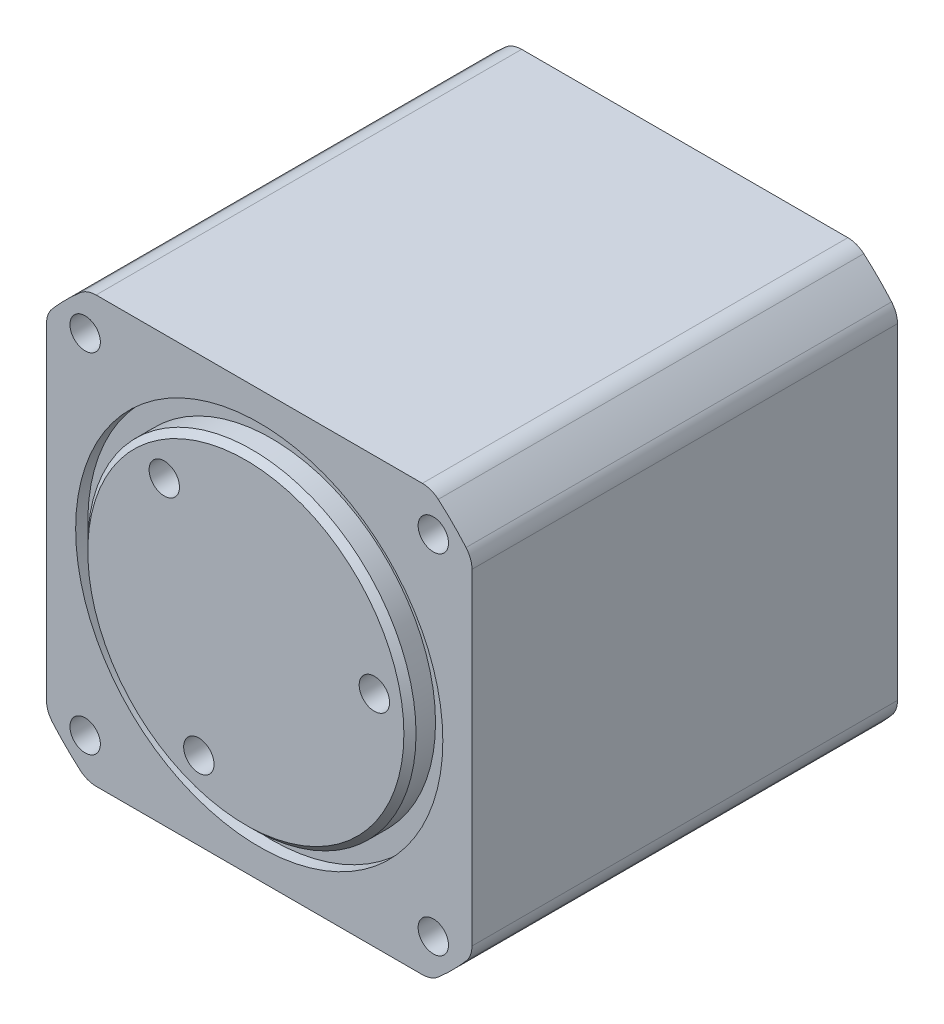
ISO-10303-21;
HEADER;
FILE_DESCRIPTION(('STEP AP214'),'2;1');
FILE_NAME('part.step','',(''),(''),'','','');
FILE_SCHEMA(('AUTOMOTIVE_DESIGN { 1 0 10303 214 1 1 1 1 }'));
ENDSEC;
DATA;
#1=APPLICATION_CONTEXT('core data for automotive mechanical design processes');
#2=APPLICATION_PROTOCOL_DEFINITION('international standard','automotive_design',2000,#1);
#3=PRODUCT_CONTEXT('',#1,'mechanical');
#4=PRODUCT('Part','Part','',(#3));
#5=PRODUCT_RELATED_PRODUCT_CATEGORY('part','',(#4));
#6=PRODUCT_DEFINITION_FORMATION('','',#4);
#7=PRODUCT_DEFINITION_CONTEXT('part definition',#1,'design');
#8=PRODUCT_DEFINITION('design','',#6,#7);
#9=PRODUCT_DEFINITION_SHAPE('','',#8);
#10=(LENGTH_UNIT() NAMED_UNIT(*) SI_UNIT(.MILLI.,.METRE.));
#11=(NAMED_UNIT(*) PLANE_ANGLE_UNIT() SI_UNIT($,.RADIAN.));
#12=(NAMED_UNIT(*) SI_UNIT($,.STERADIAN.) SOLID_ANGLE_UNIT());
#13=UNCERTAINTY_MEASURE_WITH_UNIT(LENGTH_MEASURE(1.E-05),#10,'distance_accuracy_value','');
#14=(GEOMETRIC_REPRESENTATION_CONTEXT(3) GLOBAL_UNCERTAINTY_ASSIGNED_CONTEXT((#13)) GLOBAL_UNIT_ASSIGNED_CONTEXT((#10,
#11,#12)) REPRESENTATION_CONTEXT('',''));
#15=CARTESIAN_POINT('',(0.,0.,0.));
#16=DIRECTION('',(0.,0.,1.));
#17=DIRECTION('',(1.,0.,0.));
#18=AXIS2_PLACEMENT_3D('',#15,#16,#17);
#19=CARTESIAN_POINT('',(0.,0.,35.6025));
#20=DIRECTION('',(0.,0.,-1.));
#21=DIRECTION('',(-1.,0.,0.));
#22=AXIS2_PLACEMENT_3D('',#19,#20,#21);
#23=CONICAL_SURFACE('',#22,13.5,0.7853981625);
#24=CARTESIAN_POINT('',(0.,0.,35.6025));
#25=DIRECTION('',(0.,0.,-1.));
#26=DIRECTION('',(1.,0.,0.));
#27=AXIS2_PLACEMENT_3D('',#24,#25,#26);
#28=CIRCLE('',#27,13.5);
#29=CARTESIAN_POINT('',(13.5,0.,35.6025));
#30=VERTEX_POINT('',#29);
#31=EDGE_CURVE('E147',#30,#30,#28,.T.);
#32=ORIENTED_EDGE('',*,*,#31,.F.);
#33=EDGE_LOOP('',(#32));
#34=FACE_BOUND('',#33,.T.);
#35=CARTESIAN_POINT('',(0.,0.,36.1025));
#36=DIRECTION('',(0.,0.,1.));
#37=DIRECTION('',(1.,0.,0.));
#38=AXIS2_PLACEMENT_3D('',#35,#36,#37);
#39=CIRCLE('',#38,13.);
#40=CARTESIAN_POINT('',(13.,0.,36.1025));
#41=VERTEX_POINT('',#40);
#42=EDGE_CURVE('E223',#41,#41,#39,.T.);
#43=ORIENTED_EDGE('',*,*,#42,.F.);
#44=EDGE_LOOP('',(#43));
#45=FACE_BOUND('',#44,.T.);
#46=ADVANCED_FACE('F16',(#34,#45),#23,.T.);
#47=CARTESIAN_POINT('',(10.5733557973744,1.64138575055606,30.1));
#48=DIRECTION('',(0.,0.,1.));
#49=DIRECTION('',(1.,0.,0.));
#50=AXIS2_PLACEMENT_3D('',#47,#48,#49);
#51=CYLINDRICAL_SURFACE('',#50,1.25);
#52=CARTESIAN_POINT('',(10.5733557973744,1.64138575055606,36.1025));
#53=DIRECTION('',(0.,0.,1.));
#54=DIRECTION('',(1.,0.,0.));
#55=AXIS2_PLACEMENT_3D('',#52,#53,#54);
#56=CIRCLE('',#55,1.25);
#57=CARTESIAN_POINT('',(11.8233557973744,1.64138575055606,36.1025));
#58=VERTEX_POINT('',#57);
#59=EDGE_CURVE('E233',#58,#58,#56,.T.);
#60=ORIENTED_EDGE('',*,*,#59,.T.);
#61=EDGE_LOOP('',(#60));
#62=FACE_BOUND('',#61,.T.);
#63=CARTESIAN_POINT('',(10.5733557973744,1.64138575055606,30.1));
#64=DIRECTION('',(0.,0.,-1.));
#65=DIRECTION('',(1.,0.,0.));
#66=AXIS2_PLACEMENT_3D('',#63,#64,#65);
#67=CIRCLE('',#66,1.25);
#68=CARTESIAN_POINT('',(11.8233557973744,1.64138575055606,30.1));
#69=VERTEX_POINT('',#68);
#70=EDGE_CURVE('E10',#69,#69,#67,.T.);
#71=ORIENTED_EDGE('',*,*,#70,.T.);
#72=EDGE_LOOP('',(#71));
#73=FACE_BOUND('',#72,.T.);
#74=ADVANCED_FACE('F274',(#62,#73),#51,.F.);
#75=CARTESIAN_POINT('',(10.5733557973744,1.64138575055606,30.1));
#76=DIRECTION('',(0.,0.,1.));
#77=DIRECTION('',(1.,0.,0.));
#78=AXIS2_PLACEMENT_3D('',#75,#76,#77);
#79=PLANE('',#78);
#80=ORIENTED_EDGE('',*,*,#70,.F.);
#81=EDGE_LOOP('',(#80));
#82=FACE_BOUND('',#81,.T.);
#83=ADVANCED_FACE('F279',(#82),#79,.T.);
#84=CARTESIAN_POINT('',(-3.86519614129574,-9.97748759905586,30.1));
#85=DIRECTION('',(0.,0.,1.));
#86=DIRECTION('',(1.,0.,0.));
#87=AXIS2_PLACEMENT_3D('',#84,#85,#86);
#88=CYLINDRICAL_SURFACE('',#87,1.25);
#89=CARTESIAN_POINT('',(-3.86519614129574,-9.97748759905586,36.1025));
#90=DIRECTION('',(0.,0.,1.));
#91=DIRECTION('',(1.,0.,0.));
#92=AXIS2_PLACEMENT_3D('',#89,#90,#91);
#93=CIRCLE('',#92,1.25);
#94=CARTESIAN_POINT('',(-2.61519614129574,-9.97748759905586,36.1025));
#95=VERTEX_POINT('',#94);
#96=EDGE_CURVE('E237',#95,#95,#93,.T.);
#97=ORIENTED_EDGE('',*,*,#96,.T.);
#98=EDGE_LOOP('',(#97));
#99=FACE_BOUND('',#98,.T.);
#100=CARTESIAN_POINT('',(-3.86519614129574,-9.97748759905586,30.1));
#101=DIRECTION('',(0.,0.,-1.));
#102=DIRECTION('',(1.,0.,0.));
#103=AXIS2_PLACEMENT_3D('',#100,#101,#102);
#104=CIRCLE('',#103,1.25);
#105=CARTESIAN_POINT('',(-2.61519614129574,-9.97748759905586,30.1));
#106=VERTEX_POINT('',#105);
#107=EDGE_CURVE('E25',#106,#106,#104,.T.);
#108=ORIENTED_EDGE('',*,*,#107,.T.);
#109=EDGE_LOOP('',(#108));
#110=FACE_BOUND('',#109,.T.);
#111=ADVANCED_FACE('F391',(#99,#110),#88,.F.);
#112=CARTESIAN_POINT('',(-3.86519614129574,-9.97748759905586,30.1));
#113=DIRECTION('',(0.,0.,1.));
#114=DIRECTION('',(1.,0.,0.));
#115=AXIS2_PLACEMENT_3D('',#112,#113,#114);
#116=PLANE('',#115);
#117=ORIENTED_EDGE('',*,*,#107,.F.);
#118=EDGE_LOOP('',(#117));
#119=FACE_BOUND('',#118,.T.);
#120=ADVANCED_FACE('F389',(#119),#116,.T.);
#121=CARTESIAN_POINT('',(-6.70815965607852,8.33610184849967,30.1));
#122=DIRECTION('',(0.,0.,1.));
#123=DIRECTION('',(1.,0.,0.));
#124=AXIS2_PLACEMENT_3D('',#121,#122,#123);
#125=CYLINDRICAL_SURFACE('',#124,1.25);
#126=CARTESIAN_POINT('',(-6.70815965607852,8.33610184849967,36.1025));
#127=DIRECTION('',(0.,0.,1.));
#128=DIRECTION('',(1.,0.,0.));
#129=AXIS2_PLACEMENT_3D('',#126,#127,#128);
#130=CIRCLE('',#129,1.25);
#131=CARTESIAN_POINT('',(-5.45815965607852,8.33610184849967,36.1025));
#132=VERTEX_POINT('',#131);
#133=EDGE_CURVE('E151',#132,#132,#130,.T.);
#134=ORIENTED_EDGE('',*,*,#133,.T.);
#135=EDGE_LOOP('',(#134));
#136=FACE_BOUND('',#135,.T.);
#137=CARTESIAN_POINT('',(-6.70815965607852,8.33610184849967,30.1));
#138=DIRECTION('',(0.,0.,-1.));
#139=DIRECTION('',(1.,0.,0.));
#140=AXIS2_PLACEMENT_3D('',#137,#138,#139);
#141=CIRCLE('',#140,1.25);
#142=CARTESIAN_POINT('',(-5.45815965607852,8.33610184849967,30.1));
#143=VERTEX_POINT('',#142);
#144=EDGE_CURVE('E75',#143,#143,#141,.T.);
#145=ORIENTED_EDGE('',*,*,#144,.T.);
#146=EDGE_LOOP('',(#145));
#147=FACE_BOUND('',#146,.T.);
#148=ADVANCED_FACE('F76',(#136,#147),#125,.F.);
#149=CARTESIAN_POINT('',(-6.70815965607852,8.33610184849967,30.1));
#150=DIRECTION('',(0.,0.,1.));
#151=DIRECTION('',(1.,0.,0.));
#152=AXIS2_PLACEMENT_3D('',#149,#150,#151);
#153=PLANE('',#152);
#154=ORIENTED_EDGE('',*,*,#144,.F.);
#155=EDGE_LOOP('',(#154));
#156=FACE_BOUND('',#155,.T.);
#157=ADVANCED_FACE('F379',(#156),#153,.T.);
#158=CARTESIAN_POINT('',(14.3189123190277,-14.3189123190275,6.));
#159=DIRECTION('',(0.,0.,1.));
#160=DIRECTION('',(1.,0.,0.));
#161=AXIS2_PLACEMENT_3D('',#158,#159,#160);
#162=PLANE('',#161);
#163=CARTESIAN_POINT('',(14.3189123190277,-14.3189123190275,6.));
#164=DIRECTION('',(0.,0.,-1.));
#165=DIRECTION('',(1.,0.,0.));
#166=AXIS2_PLACEMENT_3D('',#163,#164,#165);
#167=CIRCLE('',#166,1.25);
#168=CARTESIAN_POINT('',(15.5689123190277,-14.3189123190275,6.));
#169=VERTEX_POINT('',#168);
#170=EDGE_CURVE('E79',#169,#169,#167,.T.);
#171=ORIENTED_EDGE('',*,*,#170,.T.);
#172=EDGE_LOOP('',(#171));
#173=FACE_BOUND('',#172,.T.);
#174=ADVANCED_FACE('F374',(#173),#162,.F.);
#175=CARTESIAN_POINT('',(14.3189123190277,-14.3189123190275,6.));
#176=DIRECTION('',(0.,0.,-1.));
#177=DIRECTION('',(0.,1.,0.));
#178=AXIS2_PLACEMENT_3D('',#175,#176,#177);
#179=CYLINDRICAL_SURFACE('',#178,1.25);
#180=CARTESIAN_POINT('',(14.3189123190277,-14.3189123190275,0.));
#181=DIRECTION('',(0.,0.,1.));
#182=DIRECTION('',(1.,0.,0.));
#183=AXIS2_PLACEMENT_3D('',#180,#181,#182);
#184=CIRCLE('',#183,1.25);
#185=CARTESIAN_POINT('',(15.5689123190277,-14.3189123190275,0.));
#186=VERTEX_POINT('',#185);
#187=EDGE_CURVE('E201',#186,#186,#184,.T.);
#188=ORIENTED_EDGE('',*,*,#187,.F.);
#189=EDGE_LOOP('',(#188));
#190=FACE_BOUND('',#189,.T.);
#191=ORIENTED_EDGE('',*,*,#170,.F.);
#192=EDGE_LOOP('',(#191));
#193=FACE_BOUND('',#192,.T.);
#194=ADVANCED_FACE('F370',(#190,#193),#179,.F.);
#195=CARTESIAN_POINT('',(-14.3189123190277,14.3189123190275,6.));
#196=DIRECTION('',(0.,0.,1.));
#197=DIRECTION('',(1.,0.,0.));
#198=AXIS2_PLACEMENT_3D('',#195,#196,#197);
#199=PLANE('',#198);
#200=CARTESIAN_POINT('',(-14.3189123190277,14.3189123190275,6.));
#201=DIRECTION('',(0.,0.,-1.));
#202=DIRECTION('',(1.,0.,0.));
#203=AXIS2_PLACEMENT_3D('',#200,#201,#202);
#204=CIRCLE('',#203,1.25);
#205=CARTESIAN_POINT('',(-13.0689123190277,14.3189123190275,6.));
#206=VERTEX_POINT('',#205);
#207=EDGE_CURVE('E86',#206,#206,#204,.T.);
#208=ORIENTED_EDGE('',*,*,#207,.T.);
#209=EDGE_LOOP('',(#208));
#210=FACE_BOUND('',#209,.T.);
#211=ADVANCED_FACE('F373',(#210),#199,.F.);
#212=CARTESIAN_POINT('',(-14.3189123190277,14.3189123190275,6.));
#213=DIRECTION('',(0.,0.,-1.));
#214=DIRECTION('',(0.,1.,0.));
#215=AXIS2_PLACEMENT_3D('',#212,#213,#214);
#216=CYLINDRICAL_SURFACE('',#215,1.25);
#217=CARTESIAN_POINT('',(-14.3189123190277,14.3189123190275,0.));
#218=DIRECTION('',(0.,0.,1.));
#219=DIRECTION('',(1.,0.,0.));
#220=AXIS2_PLACEMENT_3D('',#217,#218,#219);
#221=CIRCLE('',#220,1.25);
#222=CARTESIAN_POINT('',(-13.0689123190277,14.3189123190275,0.));
#223=VERTEX_POINT('',#222);
#224=EDGE_CURVE('E206',#223,#223,#221,.T.);
#225=ORIENTED_EDGE('',*,*,#224,.F.);
#226=EDGE_LOOP('',(#225));
#227=FACE_BOUND('',#226,.T.);
#228=ORIENTED_EDGE('',*,*,#207,.F.);
#229=EDGE_LOOP('',(#228));
#230=FACE_BOUND('',#229,.T.);
#231=ADVANCED_FACE('F270',(#227,#230),#216,.F.);
#232=CARTESIAN_POINT('',(-14.3189123190277,-14.3189123190275,6.));
#233=DIRECTION('',(0.,0.,1.));
#234=DIRECTION('',(1.,0.,0.));
#235=AXIS2_PLACEMENT_3D('',#232,#233,#234);
#236=PLANE('',#235);
#237=CARTESIAN_POINT('',(-14.3189123190277,-14.3189123190275,6.));
#238=DIRECTION('',(0.,0.,-1.));
#239=DIRECTION('',(1.,0.,0.));
#240=AXIS2_PLACEMENT_3D('',#237,#238,#239);
#241=CIRCLE('',#240,1.25);
#242=CARTESIAN_POINT('',(-13.0689123190277,-14.3189123190275,6.));
#243=VERTEX_POINT('',#242);
#244=EDGE_CURVE('E196',#243,#243,#241,.T.);
#245=ORIENTED_EDGE('',*,*,#244,.T.);
#246=EDGE_LOOP('',(#245));
#247=FACE_BOUND('',#246,.T.);
#248=ADVANCED_FACE('F253',(#247),#236,.F.);
#249=CARTESIAN_POINT('',(-14.3189123190277,-14.3189123190275,6.));
#250=DIRECTION('',(0.,0.,-1.));
#251=DIRECTION('',(0.,1.,0.));
#252=AXIS2_PLACEMENT_3D('',#249,#250,#251);
#253=CYLINDRICAL_SURFACE('',#252,1.25);
#254=CARTESIAN_POINT('',(-14.3189123190277,-14.3189123190275,0.));
#255=DIRECTION('',(0.,0.,1.));
#256=DIRECTION('',(1.,0.,0.));
#257=AXIS2_PLACEMENT_3D('',#254,#255,#256);
#258=CIRCLE('',#257,1.25);
#259=CARTESIAN_POINT('',(-13.0689123190277,-14.3189123190275,0.));
#260=VERTEX_POINT('',#259);
#261=EDGE_CURVE('E210',#260,#260,#258,.T.);
#262=ORIENTED_EDGE('',*,*,#261,.F.);
#263=EDGE_LOOP('',(#262));
#264=FACE_BOUND('',#263,.T.);
#265=ORIENTED_EDGE('',*,*,#244,.F.);
#266=EDGE_LOOP('',(#265));
#267=FACE_BOUND('',#266,.T.);
#268=ADVANCED_FACE('F257',(#264,#267),#253,.F.);
#269=CARTESIAN_POINT('',(14.3189123190277,14.3189123190275,6.));
#270=DIRECTION('',(0.,0.,1.));
#271=DIRECTION('',(1.,0.,0.));
#272=AXIS2_PLACEMENT_3D('',#269,#270,#271);
#273=PLANE('',#272);
#274=CARTESIAN_POINT('',(14.3189123190277,14.3189123190275,6.));
#275=DIRECTION('',(0.,0.,-1.));
#276=DIRECTION('',(1.,0.,0.));
#277=AXIS2_PLACEMENT_3D('',#274,#275,#276);
#278=CIRCLE('',#277,1.25);
#279=CARTESIAN_POINT('',(15.5689123190277,14.3189123190275,6.));
#280=VERTEX_POINT('',#279);
#281=EDGE_CURVE('E228',#280,#280,#278,.T.);
#282=ORIENTED_EDGE('',*,*,#281,.T.);
#283=EDGE_LOOP('',(#282));
#284=FACE_BOUND('',#283,.T.);
#285=ADVANCED_FACE('F259',(#284),#273,.F.);
#286=CARTESIAN_POINT('',(14.3189123190277,14.3189123190275,6.));
#287=DIRECTION('',(0.,0.,-1.));
#288=DIRECTION('',(0.,1.,0.));
#289=AXIS2_PLACEMENT_3D('',#286,#287,#288);
#290=CYLINDRICAL_SURFACE('',#289,1.25);
#291=CARTESIAN_POINT('',(14.3189123190277,14.3189123190275,0.));
#292=DIRECTION('',(0.,0.,1.));
#293=DIRECTION('',(1.,0.,0.));
#294=AXIS2_PLACEMENT_3D('',#291,#292,#293);
#295=CIRCLE('',#294,1.25);
#296=CARTESIAN_POINT('',(15.5689123190277,14.3189123190275,0.));
#297=VERTEX_POINT('',#296);
#298=EDGE_CURVE('E211',#297,#297,#295,.T.);
#299=ORIENTED_EDGE('',*,*,#298,.F.);
#300=EDGE_LOOP('',(#299));
#301=FACE_BOUND('',#300,.T.);
#302=ORIENTED_EDGE('',*,*,#281,.F.);
#303=EDGE_LOOP('',(#302));
#304=FACE_BOUND('',#303,.T.);
#305=ADVANCED_FACE('F267',(#301,#304),#290,.F.);
#306=CARTESIAN_POINT('',(14.3189123190277,-14.3189123190275,29.));
#307=DIRECTION('',(0.,0.,1.));
#308=DIRECTION('',(1.,0.,0.));
#309=AXIS2_PLACEMENT_3D('',#306,#307,#308);
#310=PLANE('',#309);
#311=CARTESIAN_POINT('',(14.3189123190277,-14.3189123190275,29.));
#312=DIRECTION('',(0.,0.,-1.));
#313=DIRECTION('',(1.,0.,0.));
#314=AXIS2_PLACEMENT_3D('',#311,#312,#313);
#315=CIRCLE('',#314,1.25);
#316=CARTESIAN_POINT('',(15.5689123190277,-14.3189123190275,29.));
#317=VERTEX_POINT('',#316);
#318=EDGE_CURVE('E224',#317,#317,#315,.T.);
#319=ORIENTED_EDGE('',*,*,#318,.F.);
#320=EDGE_LOOP('',(#319));
#321=FACE_BOUND('',#320,.T.);
#322=ADVANCED_FACE('F335',(#321),#310,.T.);
#323=CARTESIAN_POINT('',(14.3189123190277,-14.3189123190275,29.));
#324=DIRECTION('',(0.,0.,1.));
#325=DIRECTION('',(1.,0.,0.));
#326=AXIS2_PLACEMENT_3D('',#323,#324,#325);
#327=CYLINDRICAL_SURFACE('',#326,1.25);
#328=CARTESIAN_POINT('',(14.3189123190277,-14.3189123190275,35.));
#329=DIRECTION('',(0.,0.,1.));
#330=DIRECTION('',(1.,0.,0.));
#331=AXIS2_PLACEMENT_3D('',#328,#329,#330);
#332=CIRCLE('',#331,1.25);
#333=CARTESIAN_POINT('',(15.5689123190277,-14.3189123190275,35.));
#334=VERTEX_POINT('',#333);
#335=EDGE_CURVE('E185',#334,#334,#332,.T.);
#336=ORIENTED_EDGE('',*,*,#335,.T.);
#337=EDGE_LOOP('',(#336));
#338=FACE_BOUND('',#337,.T.);
#339=ORIENTED_EDGE('',*,*,#318,.T.);
#340=EDGE_LOOP('',(#339));
#341=FACE_BOUND('',#340,.T.);
#342=ADVANCED_FACE('F331',(#338,#341),#327,.F.);
#343=CARTESIAN_POINT('',(-14.3189123190277,14.3189123190275,29.));
#344=DIRECTION('',(0.,0.,1.));
#345=DIRECTION('',(1.,0.,0.));
#346=AXIS2_PLACEMENT_3D('',#343,#344,#345);
#347=PLANE('',#346);
#348=CARTESIAN_POINT('',(-14.3189123190277,14.3189123190275,29.));
#349=DIRECTION('',(0.,0.,-1.));
#350=DIRECTION('',(1.,0.,0.));
#351=AXIS2_PLACEMENT_3D('',#348,#349,#350);
#352=CIRCLE('',#351,1.25);
#353=CARTESIAN_POINT('',(-13.0689123190277,14.3189123190275,29.));
#354=VERTEX_POINT('',#353);
#355=EDGE_CURVE('E229',#354,#354,#352,.T.);
#356=ORIENTED_EDGE('',*,*,#355,.F.);
#357=EDGE_LOOP('',(#356));
#358=FACE_BOUND('',#357,.T.);
#359=ADVANCED_FACE('F327',(#358),#347,.T.);
#360=CARTESIAN_POINT('',(-14.3189123190277,14.3189123190275,29.));
#361=DIRECTION('',(0.,0.,1.));
#362=DIRECTION('',(1.,0.,0.));
#363=AXIS2_PLACEMENT_3D('',#360,#361,#362);
#364=CYLINDRICAL_SURFACE('',#363,1.25);
#365=CARTESIAN_POINT('',(-14.3189123190277,14.3189123190275,35.));
#366=DIRECTION('',(0.,0.,1.));
#367=DIRECTION('',(1.,0.,0.));
#368=AXIS2_PLACEMENT_3D('',#365,#366,#367);
#369=CIRCLE('',#368,1.25);
#370=CARTESIAN_POINT('',(-13.0689123190277,14.3189123190275,35.));
#371=VERTEX_POINT('',#370);
#372=EDGE_CURVE('E189',#371,#371,#369,.T.);
#373=ORIENTED_EDGE('',*,*,#372,.T.);
#374=EDGE_LOOP('',(#373));
#375=FACE_BOUND('',#374,.T.);
#376=ORIENTED_EDGE('',*,*,#355,.T.);
#377=EDGE_LOOP('',(#376));
#378=FACE_BOUND('',#377,.T.);
#379=ADVANCED_FACE('F323',(#375,#378),#364,.F.);
#380=CARTESIAN_POINT('',(-14.3189123190277,-14.3189123190275,29.));
#381=DIRECTION('',(0.,0.,1.));
#382=DIRECTION('',(1.,0.,0.));
#383=AXIS2_PLACEMENT_3D('',#380,#381,#382);
#384=PLANE('',#383);
#385=CARTESIAN_POINT('',(-14.3189123190277,-14.3189123190275,29.));
#386=DIRECTION('',(0.,0.,-1.));
#387=DIRECTION('',(1.,0.,0.));
#388=AXIS2_PLACEMENT_3D('',#385,#386,#387);
#389=CIRCLE('',#388,1.25);
#390=CARTESIAN_POINT('',(-13.0689123190277,-14.3189123190275,29.));
#391=VERTEX_POINT('',#390);
#392=EDGE_CURVE('E242',#391,#391,#389,.T.);
#393=ORIENTED_EDGE('',*,*,#392,.F.);
#394=EDGE_LOOP('',(#393));
#395=FACE_BOUND('',#394,.T.);
#396=ADVANCED_FACE('F319',(#395),#384,.T.);
#397=CARTESIAN_POINT('',(-14.3189123190277,-14.3189123190275,29.));
#398=DIRECTION('',(0.,0.,1.));
#399=DIRECTION('',(1.,0.,0.));
#400=AXIS2_PLACEMENT_3D('',#397,#398,#399);
#401=CYLINDRICAL_SURFACE('',#400,1.25);
#402=CARTESIAN_POINT('',(-14.3189123190277,-14.3189123190275,35.));
#403=DIRECTION('',(0.,0.,1.));
#404=DIRECTION('',(1.,0.,0.));
#405=AXIS2_PLACEMENT_3D('',#402,#403,#404);
#406=CIRCLE('',#405,1.25);
#407=CARTESIAN_POINT('',(-13.0689123190277,-14.3189123190275,35.));
#408=VERTEX_POINT('',#407);
#409=EDGE_CURVE('E193',#408,#408,#406,.T.);
#410=ORIENTED_EDGE('',*,*,#409,.T.);
#411=EDGE_LOOP('',(#410));
#412=FACE_BOUND('',#411,.T.);
#413=ORIENTED_EDGE('',*,*,#392,.T.);
#414=EDGE_LOOP('',(#413));
#415=FACE_BOUND('',#414,.T.);
#416=ADVANCED_FACE('F315',(#412,#415),#401,.F.);
#417=CARTESIAN_POINT('',(14.3189123190277,14.3189123190275,29.));
#418=DIRECTION('',(0.,0.,1.));
#419=DIRECTION('',(1.,0.,0.));
#420=AXIS2_PLACEMENT_3D('',#417,#418,#419);
#421=PLANE('',#420);
#422=CARTESIAN_POINT('',(14.3189123190277,14.3189123190275,29.));
#423=DIRECTION('',(0.,0.,-1.));
#424=DIRECTION('',(1.,0.,0.));
#425=AXIS2_PLACEMENT_3D('',#422,#423,#424);
#426=CIRCLE('',#425,1.25);
#427=CARTESIAN_POINT('',(15.5689123190277,14.3189123190275,29.));
#428=VERTEX_POINT('',#427);
#429=EDGE_CURVE('E150',#428,#428,#426,.T.);
#430=ORIENTED_EDGE('',*,*,#429,.F.);
#431=EDGE_LOOP('',(#430));
#432=FACE_BOUND('',#431,.T.);
#433=ADVANCED_FACE('F311',(#432),#421,.T.);
#434=CARTESIAN_POINT('',(14.3189123190277,14.3189123190275,29.));
#435=DIRECTION('',(0.,0.,1.));
#436=DIRECTION('',(1.,0.,0.));
#437=AXIS2_PLACEMENT_3D('',#434,#435,#436);
#438=CYLINDRICAL_SURFACE('',#437,1.25);
#439=CARTESIAN_POINT('',(14.3189123190277,14.3189123190275,35.));
#440=DIRECTION('',(0.,0.,1.));
#441=DIRECTION('',(1.,0.,0.));
#442=AXIS2_PLACEMENT_3D('',#439,#440,#441);
#443=CIRCLE('',#442,1.25);
#444=CARTESIAN_POINT('',(15.5689123190277,14.3189123190275,35.));
#445=VERTEX_POINT('',#444);
#446=EDGE_CURVE('E202',#445,#445,#443,.T.);
#447=ORIENTED_EDGE('',*,*,#446,.T.);
#448=EDGE_LOOP('',(#447));
#449=FACE_BOUND('',#448,.T.);
#450=ORIENTED_EDGE('',*,*,#429,.T.);
#451=EDGE_LOOP('',(#450));
#452=FACE_BOUND('',#451,.T.);
#453=ADVANCED_FACE('F302',(#449,#452),#438,.F.);
#454=CARTESIAN_POINT('',(0.,0.,36.1025));
#455=DIRECTION('',(0.,0.,-1.));
#456=DIRECTION('',(-1.,0.,0.));
#457=AXIS2_PLACEMENT_3D('',#454,#455,#456);
#458=CYLINDRICAL_SURFACE('',#457,13.5);
#459=CARTESIAN_POINT('',(0.,0.,34.));
#460=DIRECTION('',(0.,0.,-1.));
#461=DIRECTION('',(1.,0.,0.));
#462=AXIS2_PLACEMENT_3D('',#459,#460,#461);
#463=CIRCLE('',#462,13.5);
#464=CARTESIAN_POINT('',(13.5,0.,34.));
#465=VERTEX_POINT('',#464);
#466=EDGE_CURVE('E219',#465,#465,#463,.T.);
#467=ORIENTED_EDGE('',*,*,#466,.F.);
#468=EDGE_LOOP('',(#467));
#469=FACE_BOUND('',#468,.T.);
#470=ORIENTED_EDGE('',*,*,#31,.T.);
#471=EDGE_LOOP('',(#470));
#472=FACE_BOUND('',#471,.T.);
#473=ADVANCED_FACE('F292',(#469,#472),#458,.T.);
#474=CARTESIAN_POINT('',(0.,0.,36.1025));
#475=DIRECTION('',(0.,0.,1.));
#476=DIRECTION('',(1.,0.,0.));
#477=AXIS2_PLACEMENT_3D('',#474,#475,#476);
#478=PLANE('',#477);
#479=ORIENTED_EDGE('',*,*,#133,.F.);
#480=EDGE_LOOP('',(#479));
#481=FACE_BOUND('',#480,.T.);
#482=ORIENTED_EDGE('',*,*,#96,.F.);
#483=EDGE_LOOP('',(#482));
#484=FACE_BOUND('',#483,.T.);
#485=ORIENTED_EDGE('',*,*,#59,.F.);
#486=EDGE_LOOP('',(#485));
#487=FACE_BOUND('',#486,.T.);
#488=ORIENTED_EDGE('',*,*,#42,.T.);
#489=EDGE_LOOP('',(#488));
#490=FACE_BOUND('',#489,.T.);
#491=ADVANCED_FACE('F289',(#481,#484,#487,#490),#478,.T.);
#492=CARTESIAN_POINT('',(0.,0.,34.));
#493=DIRECTION('',(0.,0.,1.));
#494=DIRECTION('',(0.,-1.,0.));
#495=AXIS2_PLACEMENT_3D('',#492,#493,#494);
#496=PLANE('',#495);
#497=ORIENTED_EDGE('',*,*,#466,.T.);
#498=EDGE_LOOP('',(#497));
#499=FACE_BOUND('',#498,.T.);
#500=CARTESIAN_POINT('',(0.,0.,34.));
#501=DIRECTION('',(0.,0.,-1.));
#502=DIRECTION('',(0.,-1.,0.));
#503=AXIS2_PLACEMENT_3D('',#500,#501,#502);
#504=CIRCLE('',#503,15.1);
#505=CARTESIAN_POINT('',(0.,-15.1,34.));
#506=VERTEX_POINT('',#505);
#507=EDGE_CURVE('E215',#506,#506,#504,.T.);
#508=ORIENTED_EDGE('',*,*,#507,.F.);
#509=EDGE_LOOP('',(#508));
#510=FACE_BOUND('',#509,.T.);
#511=ADVANCED_FACE('F291',(#499,#510),#496,.T.);
#512=CARTESIAN_POINT('',(0.,0.,34.));
#513=DIRECTION('',(0.,0.,1.));
#514=DIRECTION('',(1.,0.,0.));
#515=AXIS2_PLACEMENT_3D('',#512,#513,#514);
#516=CYLINDRICAL_SURFACE('',#515,15.1);
#517=ORIENTED_EDGE('',*,*,#507,.T.);
#518=EDGE_LOOP('',(#517));
#519=FACE_BOUND('',#518,.T.);
#520=CARTESIAN_POINT('',(0.,0.,35.));
#521=DIRECTION('',(0.,0.,1.));
#522=DIRECTION('',(1.,0.,0.));
#523=AXIS2_PLACEMENT_3D('',#520,#521,#522);
#524=CIRCLE('',#523,15.1);
#525=CARTESIAN_POINT('',(15.1,0.,35.));
#526=VERTEX_POINT('',#525);
#527=EDGE_CURVE('E197',#526,#526,#524,.T.);
#528=ORIENTED_EDGE('',*,*,#527,.T.);
#529=EDGE_LOOP('',(#528));
#530=FACE_BOUND('',#529,.T.);
#531=ADVANCED_FACE('F299',(#519,#530),#516,.F.);
#532=CARTESIAN_POINT('',(-15.5,-13.4164078649987,0.));
#533=DIRECTION('',(0.,0.,1.));
#534=DIRECTION('',(0.,-1.,0.));
#535=AXIS2_PLACEMENT_3D('',#532,#533,#534);
#536=PLANE('',#535);
#537=DIRECTION('',(0.,-1.,0.));
#538=VECTOR('',#537,1.);
#539=CARTESIAN_POINT('',(-17.5,13.4164078649987,0.));
#540=LINE('',#539,#538);
#541=CARTESIAN_POINT('',(-17.5,13.4164078649987,0.));
#542=VERTEX_POINT('',#541);
#543=CARTESIAN_POINT('',(-17.5,-13.4164078649987,0.));
#544=VERTEX_POINT('',#543);
#545=EDGE_CURVE('E962',#542,#544,#540,.T.);
#546=ORIENTED_EDGE('',*,*,#545,.F.);
#547=CARTESIAN_POINT('',(-15.5,13.4164078649987,0.));
#548=DIRECTION('',(0.,0.,1.));
#549=DIRECTION('',(0.,-1.,0.));
#550=AXIS2_PLACEMENT_3D('',#547,#548,#549);
#551=CIRCLE('',#550,2.);
#552=CARTESIAN_POINT('',(-17.0121951219512,14.7253257054864,0.));
#553=VERTEX_POINT('',#552);
#554=EDGE_CURVE('E176',#553,#542,#551,.T.);
#555=ORIENTED_EDGE('',*,*,#554,.F.);
#556=CARTESIAN_POINT('',(0.,0.,0.));
#557=DIRECTION('',(0.,0.,1.));
#558=DIRECTION('',(0.,1.,0.));
#559=AXIS2_PLACEMENT_3D('',#556,#557,#558);
#560=CIRCLE('',#559,22.5);
#561=CARTESIAN_POINT('',(-14.7253257054864,17.0121951219512,0.));
#562=VERTEX_POINT('',#561);
#563=EDGE_CURVE('E133',#562,#553,#560,.T.);
#564=ORIENTED_EDGE('',*,*,#563,.F.);
#565=CARTESIAN_POINT('',(-13.4164078649987,15.5,0.));
#566=DIRECTION('',(0.,0.,1.));
#567=DIRECTION('',(0.,-1.,0.));
#568=AXIS2_PLACEMENT_3D('',#565,#566,#567);
#569=CIRCLE('',#568,2.);
#570=CARTESIAN_POINT('',(-13.4164078649987,17.5,0.));
#571=VERTEX_POINT('',#570);
#572=EDGE_CURVE('E159',#571,#562,#569,.T.);
#573=ORIENTED_EDGE('',*,*,#572,.F.);
#574=DIRECTION('',(-1.,0.,0.));
#575=VECTOR('',#574,1.);
#576=CARTESIAN_POINT('',(13.4164078649987,17.5,0.));
#577=LINE('',#576,#575);
#578=CARTESIAN_POINT('',(13.4164078649987,17.5,0.));
#579=VERTEX_POINT('',#578);
#580=EDGE_CURVE('E118',#579,#571,#577,.T.);
#581=ORIENTED_EDGE('',*,*,#580,.F.);
#582=CARTESIAN_POINT('',(13.4164078649987,15.5,0.));
#583=DIRECTION('',(0.,0.,1.));
#584=DIRECTION('',(0.,-1.,0.));
#585=AXIS2_PLACEMENT_3D('',#582,#583,#584);
#586=CIRCLE('',#585,2.);
#587=CARTESIAN_POINT('',(14.7253257054864,17.0121951219512,0.));
#588=VERTEX_POINT('',#587);
#589=EDGE_CURVE('E142',#588,#579,#586,.T.);
#590=ORIENTED_EDGE('',*,*,#589,.F.);
#591=CARTESIAN_POINT('',(0.,0.,0.));
#592=DIRECTION('',(0.,0.,1.));
#593=DIRECTION('',(0.,1.,0.));
#594=AXIS2_PLACEMENT_3D('',#591,#592,#593);
#595=CIRCLE('',#594,22.5);
#596=CARTESIAN_POINT('',(17.0121951219512,14.7253257054864,0.));
#597=VERTEX_POINT('',#596);
#598=EDGE_CURVE('E127',#597,#588,#595,.T.);
#599=ORIENTED_EDGE('',*,*,#598,.F.);
#600=CARTESIAN_POINT('',(15.5,13.4164078649987,0.));
#601=DIRECTION('',(0.,0.,1.));
#602=DIRECTION('',(0.,-1.,0.));
#603=AXIS2_PLACEMENT_3D('',#600,#601,#602);
#604=CIRCLE('',#603,2.);
#605=CARTESIAN_POINT('',(17.5,13.4164078649987,0.));
#606=VERTEX_POINT('',#605);
#607=EDGE_CURVE('E109',#606,#597,#604,.T.);
#608=ORIENTED_EDGE('',*,*,#607,.F.);
#609=DIRECTION('',(0.,1.,0.));
#610=VECTOR('',#609,1.);
#611=CARTESIAN_POINT('',(17.5,-13.4164078649987,0.));
#612=LINE('',#611,#610);
#613=CARTESIAN_POINT('',(17.5,-13.4164078649987,0.));
#614=VERTEX_POINT('',#613);
#615=EDGE_CURVE('E100',#614,#606,#612,.T.);
#616=ORIENTED_EDGE('',*,*,#615,.F.);
#617=CARTESIAN_POINT('',(15.5,-13.4164078649987,0.));
#618=DIRECTION('',(0.,0.,1.));
#619=DIRECTION('',(0.,-1.,0.));
#620=AXIS2_PLACEMENT_3D('',#617,#618,#619);
#621=CIRCLE('',#620,2.);
#622=CARTESIAN_POINT('',(17.0121951219512,-14.7253257054864,0.));
#623=VERTEX_POINT('',#622);
#624=EDGE_CURVE('E91',#623,#614,#621,.T.);
#625=ORIENTED_EDGE('',*,*,#624,.F.);
#626=CARTESIAN_POINT('',(0.,0.,0.));
#627=DIRECTION('',(0.,0.,1.));
#628=DIRECTION('',(0.,1.,0.));
#629=AXIS2_PLACEMENT_3D('',#626,#627,#628);
#630=CIRCLE('',#629,22.5);
#631=CARTESIAN_POINT('',(14.7253257054864,-17.0121951219512,0.));
#632=VERTEX_POINT('',#631);
#633=EDGE_CURVE('E836',#632,#623,#630,.T.);
#634=ORIENTED_EDGE('',*,*,#633,.F.);
#635=CARTESIAN_POINT('',(13.4164078649987,-15.5,0.));
#636=DIRECTION('',(0.,0.,1.));
#637=DIRECTION('',(0.,-1.,0.));
#638=AXIS2_PLACEMENT_3D('',#635,#636,#637);
#639=CIRCLE('',#638,2.);
#640=CARTESIAN_POINT('',(13.4164078649987,-17.5,0.));
#641=VERTEX_POINT('',#640);
#642=EDGE_CURVE('E866',#641,#632,#639,.T.);
#643=ORIENTED_EDGE('',*,*,#642,.F.);
#644=DIRECTION('',(1.,0.,0.));
#645=VECTOR('',#644,1.);
#646=CARTESIAN_POINT('',(-13.4164078649987,-17.5,0.));
#647=LINE('',#646,#645);
#648=CARTESIAN_POINT('',(-13.4164078649987,-17.5,0.));
#649=VERTEX_POINT('',#648);
#650=EDGE_CURVE('E880',#649,#641,#647,.T.);
#651=ORIENTED_EDGE('',*,*,#650,.F.);
#652=CARTESIAN_POINT('',(-13.4164078649987,-15.5,0.));
#653=DIRECTION('',(0.,0.,1.));
#654=DIRECTION('',(0.,-1.,0.));
#655=AXIS2_PLACEMENT_3D('',#652,#653,#654);
#656=CIRCLE('',#655,2.);
#657=CARTESIAN_POINT('',(-14.7253257054864,-17.0121951219512,0.));
#658=VERTEX_POINT('',#657);
#659=EDGE_CURVE('E888',#658,#649,#656,.T.);
#660=ORIENTED_EDGE('',*,*,#659,.F.);
#661=CARTESIAN_POINT('',(0.,0.,0.));
#662=DIRECTION('',(0.,0.,1.));
#663=DIRECTION('',(0.,1.,0.));
#664=AXIS2_PLACEMENT_3D('',#661,#662,#663);
#665=CIRCLE('',#664,22.5);
#666=CARTESIAN_POINT('',(-17.0121951219512,-14.7253257054864,0.));
#667=VERTEX_POINT('',#666);
#668=EDGE_CURVE('E906',#667,#658,#665,.T.);
#669=ORIENTED_EDGE('',*,*,#668,.F.);
#670=CARTESIAN_POINT('',(-15.5,-13.4164078649987,0.));
#671=DIRECTION('',(0.,0.,1.));
#672=DIRECTION('',(0.,-1.,0.));
#673=AXIS2_PLACEMENT_3D('',#670,#671,#672);
#674=CIRCLE('',#673,2.);
#675=EDGE_CURVE('E929',#544,#667,#674,.T.);
#676=ORIENTED_EDGE('',*,*,#675,.F.);
#677=EDGE_LOOP('',(#546,#555,#564,#573,#581,#590,#599,#608,#616,#625,#634,#643,#651,#660,#669,#676));
#678=FACE_BOUND('',#677,.T.);
#679=ORIENTED_EDGE('',*,*,#298,.T.);
#680=EDGE_LOOP('',(#679));
#681=FACE_BOUND('',#680,.T.);
#682=ORIENTED_EDGE('',*,*,#261,.T.);
#683=EDGE_LOOP('',(#682));
#684=FACE_BOUND('',#683,.T.);
#685=ORIENTED_EDGE('',*,*,#224,.T.);
#686=EDGE_LOOP('',(#685));
#687=FACE_BOUND('',#686,.T.);
#688=ORIENTED_EDGE('',*,*,#187,.T.);
#689=EDGE_LOOP('',(#688));
#690=FACE_BOUND('',#689,.T.);
#691=ADVANCED_FACE('F353',(#678,#681,#684,#687,#690),#536,.F.);
#692=CARTESIAN_POINT('',(-15.5,-13.4164078649987,35.));
#693=DIRECTION('',(0.,0.,1.));
#694=DIRECTION('',(0.,-1.,0.));
#695=AXIS2_PLACEMENT_3D('',#692,#693,#694);
#696=PLANE('',#695);
#697=DIRECTION('',(0.,-1.,0.));
#698=VECTOR('',#697,1.);
#699=CARTESIAN_POINT('',(-17.5,13.4164078649987,35.));
#700=LINE('',#699,#698);
#701=CARTESIAN_POINT('',(-17.5,13.4164078649987,35.));
#702=VERTEX_POINT('',#701);
#703=CARTESIAN_POINT('',(-17.5,-13.4164078649987,35.));
#704=VERTEX_POINT('',#703);
#705=EDGE_CURVE('E946',#702,#704,#700,.T.);
#706=ORIENTED_EDGE('',*,*,#705,.T.);
#707=CARTESIAN_POINT('',(-15.5,-13.4164078649987,35.));
#708=DIRECTION('',(0.,0.,1.));
#709=DIRECTION('',(0.,-1.,0.));
#710=AXIS2_PLACEMENT_3D('',#707,#708,#709);
#711=CIRCLE('',#710,2.);
#712=CARTESIAN_POINT('',(-17.0121951219512,-14.7253257054864,35.));
#713=VERTEX_POINT('',#712);
#714=EDGE_CURVE('E912',#704,#713,#711,.T.);
#715=ORIENTED_EDGE('',*,*,#714,.T.);
#716=CARTESIAN_POINT('',(0.,0.,35.));
#717=DIRECTION('',(0.,0.,1.));
#718=DIRECTION('',(0.,1.,0.));
#719=AXIS2_PLACEMENT_3D('',#716,#717,#718);
#720=CIRCLE('',#719,22.5);
#721=CARTESIAN_POINT('',(-14.7253257054864,-17.0121951219512,35.));
#722=VERTEX_POINT('',#721);
#723=EDGE_CURVE('E894',#713,#722,#720,.T.);
#724=ORIENTED_EDGE('',*,*,#723,.T.);
#725=CARTESIAN_POINT('',(-13.4164078649987,-15.5,35.));
#726=DIRECTION('',(0.,0.,1.));
#727=DIRECTION('',(0.,-1.,0.));
#728=AXIS2_PLACEMENT_3D('',#725,#726,#727);
#729=CIRCLE('',#728,2.);
#730=CARTESIAN_POINT('',(-13.4164078649987,-17.5,35.));
#731=VERTEX_POINT('',#730);
#732=EDGE_CURVE('E875',#722,#731,#729,.T.);
#733=ORIENTED_EDGE('',*,*,#732,.T.);
#734=DIRECTION('',(1.,0.,0.));
#735=VECTOR('',#734,1.);
#736=CARTESIAN_POINT('',(-13.4164078649987,-17.5,35.));
#737=LINE('',#736,#735);
#738=CARTESIAN_POINT('',(13.4164078649987,-17.5,35.));
#739=VERTEX_POINT('',#738);
#740=EDGE_CURVE('E872',#731,#739,#737,.T.);
#741=ORIENTED_EDGE('',*,*,#740,.T.);
#742=CARTESIAN_POINT('',(13.4164078649987,-15.5,35.));
#743=DIRECTION('',(0.,0.,1.));
#744=DIRECTION('',(0.,-1.,0.));
#745=AXIS2_PLACEMENT_3D('',#742,#743,#744);
#746=CIRCLE('',#745,2.);
#747=CARTESIAN_POINT('',(14.7253257054864,-17.0121951219512,35.));
#748=VERTEX_POINT('',#747);
#749=EDGE_CURVE('E842',#739,#748,#746,.T.);
#750=ORIENTED_EDGE('',*,*,#749,.T.);
#751=CARTESIAN_POINT('',(0.,0.,35.));
#752=DIRECTION('',(0.,0.,1.));
#753=DIRECTION('',(0.,1.,0.));
#754=AXIS2_PLACEMENT_3D('',#751,#752,#753);
#755=CIRCLE('',#754,22.5);
#756=CARTESIAN_POINT('',(17.0121951219512,-14.7253257054864,35.));
#757=VERTEX_POINT('',#756);
#758=EDGE_CURVE('E89',#748,#757,#755,.T.);
#759=ORIENTED_EDGE('',*,*,#758,.T.);
#760=CARTESIAN_POINT('',(15.5,-13.4164078649987,35.));
#761=DIRECTION('',(0.,0.,1.));
#762=DIRECTION('',(0.,-1.,0.));
#763=AXIS2_PLACEMENT_3D('',#760,#761,#762);
#764=CIRCLE('',#763,2.);
#765=CARTESIAN_POINT('',(17.5,-13.4164078649987,35.));
#766=VERTEX_POINT('',#765);
#767=EDGE_CURVE('E96',#757,#766,#764,.T.);
#768=ORIENTED_EDGE('',*,*,#767,.T.);
#769=DIRECTION('',(0.,1.,0.));
#770=VECTOR('',#769,1.);
#771=CARTESIAN_POINT('',(17.5,-13.4164078649987,35.));
#772=LINE('',#771,#770);
#773=CARTESIAN_POINT('',(17.5,13.4164078649987,35.));
#774=VERTEX_POINT('',#773);
#775=EDGE_CURVE('E105',#766,#774,#772,.T.);
#776=ORIENTED_EDGE('',*,*,#775,.T.);
#777=CARTESIAN_POINT('',(15.5,13.4164078649987,35.));
#778=DIRECTION('',(0.,0.,1.));
#779=DIRECTION('',(0.,-1.,0.));
#780=AXIS2_PLACEMENT_3D('',#777,#778,#779);
#781=CIRCLE('',#780,2.);
#782=CARTESIAN_POINT('',(17.0121951219512,14.7253257054864,35.));
#783=VERTEX_POINT('',#782);
#784=EDGE_CURVE('E117',#774,#783,#781,.T.);
#785=ORIENTED_EDGE('',*,*,#784,.T.);
#786=CARTESIAN_POINT('',(0.,0.,35.));
#787=DIRECTION('',(0.,0.,1.));
#788=DIRECTION('',(0.,1.,0.));
#789=AXIS2_PLACEMENT_3D('',#786,#787,#788);
#790=CIRCLE('',#789,22.5);
#791=CARTESIAN_POINT('',(14.7253257054864,17.0121951219512,35.));
#792=VERTEX_POINT('',#791);
#793=EDGE_CURVE('E132',#783,#792,#790,.T.);
#794=ORIENTED_EDGE('',*,*,#793,.T.);
#795=CARTESIAN_POINT('',(13.4164078649987,15.5,35.));
#796=DIRECTION('',(0.,0.,1.));
#797=DIRECTION('',(0.,-1.,0.));
#798=AXIS2_PLACEMENT_3D('',#795,#796,#797);
#799=CIRCLE('',#798,2.);
#800=CARTESIAN_POINT('',(13.4164078649987,17.5,35.));
#801=VERTEX_POINT('',#800);
#802=EDGE_CURVE('E123',#792,#801,#799,.T.);
#803=ORIENTED_EDGE('',*,*,#802,.T.);
#804=DIRECTION('',(-1.,0.,0.));
#805=VECTOR('',#804,1.);
#806=CARTESIAN_POINT('',(13.4164078649987,17.5,35.));
#807=LINE('',#806,#805);
#808=CARTESIAN_POINT('',(-13.4164078649987,17.5,35.));
#809=VERTEX_POINT('',#808);
#810=EDGE_CURVE('E155',#801,#809,#807,.T.);
#811=ORIENTED_EDGE('',*,*,#810,.T.);
#812=CARTESIAN_POINT('',(-13.4164078649987,15.5,35.));
#813=DIRECTION('',(0.,0.,1.));
#814=DIRECTION('',(0.,-1.,0.));
#815=AXIS2_PLACEMENT_3D('',#812,#813,#814);
#816=CIRCLE('',#815,2.);
#817=CARTESIAN_POINT('',(-14.7253257054864,17.0121951219512,35.));
#818=VERTEX_POINT('',#817);
#819=EDGE_CURVE('E138',#809,#818,#816,.T.);
#820=ORIENTED_EDGE('',*,*,#819,.T.);
#821=CARTESIAN_POINT('',(0.,0.,35.));
#822=DIRECTION('',(0.,0.,1.));
#823=DIRECTION('',(0.,1.,0.));
#824=AXIS2_PLACEMENT_3D('',#821,#822,#823);
#825=CIRCLE('',#824,22.5);
#826=CARTESIAN_POINT('',(-17.0121951219512,14.7253257054864,35.));
#827=VERTEX_POINT('',#826);
#828=EDGE_CURVE('E173',#818,#827,#825,.T.);
#829=ORIENTED_EDGE('',*,*,#828,.T.);
#830=CARTESIAN_POINT('',(-15.5,13.4164078649987,35.));
#831=DIRECTION('',(0.,0.,1.));
#832=DIRECTION('',(0.,-1.,0.));
#833=AXIS2_PLACEMENT_3D('',#830,#831,#832);
#834=CIRCLE('',#833,2.);
#835=EDGE_CURVE('E181',#827,#702,#834,.T.);
#836=ORIENTED_EDGE('',*,*,#835,.T.);
#837=EDGE_LOOP('',(#706,#715,#724,#733,#741,#750,#759,#768,#776,#785,#794,#803,#811,#820,#829,#836));
#838=FACE_BOUND('',#837,.T.);
#839=ORIENTED_EDGE('',*,*,#527,.F.);
#840=EDGE_LOOP('',(#839));
#841=FACE_BOUND('',#840,.T.);
#842=ORIENTED_EDGE('',*,*,#446,.F.);
#843=EDGE_LOOP('',(#842));
#844=FACE_BOUND('',#843,.T.);
#845=ORIENTED_EDGE('',*,*,#409,.F.);
#846=EDGE_LOOP('',(#845));
#847=FACE_BOUND('',#846,.T.);
#848=ORIENTED_EDGE('',*,*,#372,.F.);
#849=EDGE_LOOP('',(#848));
#850=FACE_BOUND('',#849,.T.);
#851=ORIENTED_EDGE('',*,*,#335,.F.);
#852=EDGE_LOOP('',(#851));
#853=FACE_BOUND('',#852,.T.);
#854=ADVANCED_FACE('F356',(#838,#841,#844,#847,#850,#853),#696,.T.);
#855=CARTESIAN_POINT('',(-15.5,13.4164078649987,35.));
#856=DIRECTION('',(0.,0.,-1.));
#857=DIRECTION('',(-1.,0.,0.));
#858=AXIS2_PLACEMENT_3D('',#855,#856,#857);
#859=CYLINDRICAL_SURFACE('',#858,2.);
#860=ORIENTED_EDGE('',*,*,#554,.T.);
#861=DIRECTION('',(0.,0.,-1.));
#862=VECTOR('',#861,1.);
#863=CARTESIAN_POINT('',(-17.5,13.4164078649987,35.));
#864=LINE('',#863,#862);
#865=EDGE_CURVE('E934',#702,#542,#864,.T.);
#866=ORIENTED_EDGE('',*,*,#865,.F.);
#867=ORIENTED_EDGE('',*,*,#835,.F.);
#868=DIRECTION('',(0.,0.,-1.));
#869=VECTOR('',#868,1.);
#870=CARTESIAN_POINT('',(-17.0121951219512,14.7253257054864,35.));
#871=LINE('',#870,#869);
#872=EDGE_CURVE('E137',#827,#553,#871,.T.);
#873=ORIENTED_EDGE('',*,*,#872,.T.);
#874=EDGE_LOOP('',(#860,#866,#867,#873));
#875=FACE_BOUND('',#874,.T.);
#876=ADVANCED_FACE('F564',(#875),#859,.T.);
#877=CARTESIAN_POINT('',(0.,0.,35.));
#878=DIRECTION('',(0.,0.,-1.));
#879=DIRECTION('',(-1.,0.,0.));
#880=AXIS2_PLACEMENT_3D('',#877,#878,#879);
#881=CYLINDRICAL_SURFACE('',#880,22.5);
#882=ORIENTED_EDGE('',*,*,#563,.T.);
#883=ORIENTED_EDGE('',*,*,#872,.F.);
#884=ORIENTED_EDGE('',*,*,#828,.F.);
#885=DIRECTION('',(0.,0.,-1.));
#886=VECTOR('',#885,1.);
#887=CARTESIAN_POINT('',(-14.7253257054864,17.0121951219512,35.));
#888=LINE('',#887,#886);
#889=EDGE_CURVE('E163',#818,#562,#888,.T.);
#890=ORIENTED_EDGE('',*,*,#889,.T.);
#891=EDGE_LOOP('',(#882,#883,#884,#890));
#892=FACE_BOUND('',#891,.T.);
#893=ADVANCED_FACE('F574',(#892),#881,.T.);
#894=CARTESIAN_POINT('',(-13.4164078649987,15.5,35.));
#895=DIRECTION('',(0.,0.,-1.));
#896=DIRECTION('',(-1.,0.,0.));
#897=AXIS2_PLACEMENT_3D('',#894,#895,#896);
#898=CYLINDRICAL_SURFACE('',#897,2.);
#899=ORIENTED_EDGE('',*,*,#572,.T.);
#900=ORIENTED_EDGE('',*,*,#889,.F.);
#901=ORIENTED_EDGE('',*,*,#819,.F.);
#902=DIRECTION('',(0.,0.,-1.));
#903=VECTOR('',#902,1.);
#904=CARTESIAN_POINT('',(-13.4164078649987,17.5,35.));
#905=LINE('',#904,#903);
#906=EDGE_CURVE('E122',#809,#571,#905,.T.);
#907=ORIENTED_EDGE('',*,*,#906,.T.);
#908=EDGE_LOOP('',(#899,#900,#901,#907));
#909=FACE_BOUND('',#908,.T.);
#910=ADVANCED_FACE('F584',(#909),#898,.T.);
#911=CARTESIAN_POINT('',(13.4164078649987,17.5,35.));
#912=DIRECTION('',(0.,-1.,0.));
#913=DIRECTION('',(0.,0.,-1.));
#914=AXIS2_PLACEMENT_3D('',#911,#912,#913);
#915=PLANE('',#914);
#916=ORIENTED_EDGE('',*,*,#580,.T.);
#917=ORIENTED_EDGE('',*,*,#906,.F.);
#918=ORIENTED_EDGE('',*,*,#810,.F.);
#919=DIRECTION('',(0.,0.,-1.));
#920=VECTOR('',#919,1.);
#921=CARTESIAN_POINT('',(13.4164078649987,17.5,35.));
#922=LINE('',#921,#920);
#923=EDGE_CURVE('E146',#801,#579,#922,.T.);
#924=ORIENTED_EDGE('',*,*,#923,.T.);
#925=EDGE_LOOP('',(#916,#917,#918,#924));
#926=FACE_BOUND('',#925,.T.);
#927=ADVANCED_FACE('F595',(#926),#915,.F.);
#928=CARTESIAN_POINT('',(13.4164078649987,15.5,35.));
#929=DIRECTION('',(0.,0.,-1.));
#930=DIRECTION('',(-1.,0.,0.));
#931=AXIS2_PLACEMENT_3D('',#928,#929,#930);
#932=CYLINDRICAL_SURFACE('',#931,2.);
#933=ORIENTED_EDGE('',*,*,#589,.T.);
#934=ORIENTED_EDGE('',*,*,#923,.F.);
#935=ORIENTED_EDGE('',*,*,#802,.F.);
#936=DIRECTION('',(0.,0.,-1.));
#937=VECTOR('',#936,1.);
#938=CARTESIAN_POINT('',(14.7253257054864,17.0121951219512,35.));
#939=LINE('',#938,#937);
#940=EDGE_CURVE('E128',#792,#588,#939,.T.);
#941=ORIENTED_EDGE('',*,*,#940,.T.);
#942=EDGE_LOOP('',(#933,#934,#935,#941));
#943=FACE_BOUND('',#942,.T.);
#944=ADVANCED_FACE('F606',(#943),#932,.T.);
#945=CARTESIAN_POINT('',(0.,0.,35.));
#946=DIRECTION('',(0.,0.,-1.));
#947=DIRECTION('',(-1.,0.,0.));
#948=AXIS2_PLACEMENT_3D('',#945,#946,#947);
#949=CYLINDRICAL_SURFACE('',#948,22.5);
#950=ORIENTED_EDGE('',*,*,#598,.T.);
#951=ORIENTED_EDGE('',*,*,#940,.F.);
#952=ORIENTED_EDGE('',*,*,#793,.F.);
#953=DIRECTION('',(0.,0.,-1.));
#954=VECTOR('',#953,1.);
#955=CARTESIAN_POINT('',(17.0121951219512,14.7253257054864,35.));
#956=LINE('',#955,#954);
#957=EDGE_CURVE('E113',#783,#597,#956,.T.);
#958=ORIENTED_EDGE('',*,*,#957,.T.);
#959=EDGE_LOOP('',(#950,#951,#952,#958));
#960=FACE_BOUND('',#959,.T.);
#961=ADVANCED_FACE('F618',(#960),#949,.T.);
#962=CARTESIAN_POINT('',(15.5,13.4164078649987,35.));
#963=DIRECTION('',(0.,0.,-1.));
#964=DIRECTION('',(-1.,0.,0.));
#965=AXIS2_PLACEMENT_3D('',#962,#963,#964);
#966=CYLINDRICAL_SURFACE('',#965,2.);
#967=ORIENTED_EDGE('',*,*,#607,.T.);
#968=ORIENTED_EDGE('',*,*,#957,.F.);
#969=ORIENTED_EDGE('',*,*,#784,.F.);
#970=DIRECTION('',(0.,0.,-1.));
#971=VECTOR('',#970,1.);
#972=CARTESIAN_POINT('',(17.5,13.4164078649987,35.));
#973=LINE('',#972,#971);
#974=EDGE_CURVE('E104',#774,#606,#973,.T.);
#975=ORIENTED_EDGE('',*,*,#974,.T.);
#976=EDGE_LOOP('',(#967,#968,#969,#975));
#977=FACE_BOUND('',#976,.T.);
#978=ADVANCED_FACE('F628',(#977),#966,.T.);
#979=CARTESIAN_POINT('',(17.5,-13.4164078649987,35.));
#980=DIRECTION('',(-1.,0.,0.));
#981=DIRECTION('',(0.,0.,1.));
#982=AXIS2_PLACEMENT_3D('',#979,#980,#981);
#983=PLANE('',#982);
#984=ORIENTED_EDGE('',*,*,#615,.T.);
#985=ORIENTED_EDGE('',*,*,#974,.F.);
#986=ORIENTED_EDGE('',*,*,#775,.F.);
#987=DIRECTION('',(0.,0.,-1.));
#988=VECTOR('',#987,1.);
#989=CARTESIAN_POINT('',(17.5,-13.4164078649987,35.));
#990=LINE('',#989,#988);
#991=EDGE_CURVE('E95',#766,#614,#990,.T.);
#992=ORIENTED_EDGE('',*,*,#991,.T.);
#993=EDGE_LOOP('',(#984,#985,#986,#992));
#994=FACE_BOUND('',#993,.T.);
#995=ADVANCED_FACE('F637',(#994),#983,.F.);
#996=CARTESIAN_POINT('',(15.5,-13.4164078649987,35.));
#997=DIRECTION('',(0.,0.,-1.));
#998=DIRECTION('',(-1.,0.,0.));
#999=AXIS2_PLACEMENT_3D('',#996,#997,#998);
#1000=CYLINDRICAL_SURFACE('',#999,2.);
#1001=ORIENTED_EDGE('',*,*,#624,.T.);
#1002=ORIENTED_EDGE('',*,*,#991,.F.);
#1003=ORIENTED_EDGE('',*,*,#767,.F.);
#1004=DIRECTION('',(0.,0.,-1.));
#1005=VECTOR('',#1004,1.);
#1006=CARTESIAN_POINT('',(17.0121951219512,-14.7253257054864,35.));
#1007=LINE('',#1006,#1005);
#1008=EDGE_CURVE('E828',#757,#623,#1007,.T.);
#1009=ORIENTED_EDGE('',*,*,#1008,.T.);
#1010=EDGE_LOOP('',(#1001,#1002,#1003,#1009));
#1011=FACE_BOUND('',#1010,.T.);
#1012=ADVANCED_FACE('F647',(#1011),#1000,.T.);
#1013=CARTESIAN_POINT('',(0.,0.,35.));
#1014=DIRECTION('',(0.,0.,-1.));
#1015=DIRECTION('',(-1.,0.,0.));
#1016=AXIS2_PLACEMENT_3D('',#1013,#1014,#1015);
#1017=CYLINDRICAL_SURFACE('',#1016,22.5);
#1018=ORIENTED_EDGE('',*,*,#633,.T.);
#1019=ORIENTED_EDGE('',*,*,#1008,.F.);
#1020=ORIENTED_EDGE('',*,*,#758,.F.);
#1021=DIRECTION('',(0.,0.,-1.));
#1022=VECTOR('',#1021,1.);
#1023=CARTESIAN_POINT('',(14.7253257054864,-17.0121951219512,35.));
#1024=LINE('',#1023,#1022);
#1025=EDGE_CURVE('E852',#748,#632,#1024,.T.);
#1026=ORIENTED_EDGE('',*,*,#1025,.T.);
#1027=EDGE_LOOP('',(#1018,#1019,#1020,#1026));
#1028=FACE_BOUND('',#1027,.T.);
#1029=ADVANCED_FACE('F658',(#1028),#1017,.T.);
#1030=CARTESIAN_POINT('',(13.4164078649987,-15.5,35.));
#1031=DIRECTION('',(0.,0.,-1.));
#1032=DIRECTION('',(-1.,0.,0.));
#1033=AXIS2_PLACEMENT_3D('',#1030,#1031,#1032);
#1034=CYLINDRICAL_SURFACE('',#1033,2.);
#1035=ORIENTED_EDGE('',*,*,#642,.T.);
#1036=ORIENTED_EDGE('',*,*,#1025,.F.);
#1037=ORIENTED_EDGE('',*,*,#749,.F.);
#1038=DIRECTION('',(0.,0.,-1.));
#1039=VECTOR('',#1038,1.);
#1040=CARTESIAN_POINT('',(13.4164078649987,-17.5,35.));
#1041=LINE('',#1040,#1039);
#1042=EDGE_CURVE('E937',#739,#641,#1041,.T.);
#1043=ORIENTED_EDGE('',*,*,#1042,.T.);
#1044=EDGE_LOOP('',(#1035,#1036,#1037,#1043));
#1045=FACE_BOUND('',#1044,.T.);
#1046=ADVANCED_FACE('F668',(#1045),#1034,.T.);
#1047=CARTESIAN_POINT('',(-13.4164078649987,-17.5,35.));
#1048=DIRECTION('',(0.,1.,0.));
#1049=DIRECTION('',(1.,0.,0.));
#1050=AXIS2_PLACEMENT_3D('',#1047,#1048,#1049);
#1051=PLANE('',#1050);
#1052=ORIENTED_EDGE('',*,*,#650,.T.);
#1053=ORIENTED_EDGE('',*,*,#1042,.F.);
#1054=ORIENTED_EDGE('',*,*,#740,.F.);
#1055=DIRECTION('',(0.,0.,-1.));
#1056=VECTOR('',#1055,1.);
#1057=CARTESIAN_POINT('',(-13.4164078649987,-17.5,35.));
#1058=LINE('',#1057,#1056);
#1059=EDGE_CURVE('E881',#731,#649,#1058,.T.);
#1060=ORIENTED_EDGE('',*,*,#1059,.T.);
#1061=EDGE_LOOP('',(#1052,#1053,#1054,#1060));
#1062=FACE_BOUND('',#1061,.T.);
#1063=ADVANCED_FACE('F677',(#1062),#1051,.F.);
#1064=CARTESIAN_POINT('',(-13.4164078649987,-15.5,35.));
#1065=DIRECTION('',(0.,0.,-1.));
#1066=DIRECTION('',(-1.,0.,0.));
#1067=AXIS2_PLACEMENT_3D('',#1064,#1065,#1066);
#1068=CYLINDRICAL_SURFACE('',#1067,2.);
#1069=ORIENTED_EDGE('',*,*,#659,.T.);
#1070=ORIENTED_EDGE('',*,*,#1059,.F.);
#1071=ORIENTED_EDGE('',*,*,#732,.F.);
#1072=DIRECTION('',(0.,0.,-1.));
#1073=VECTOR('',#1072,1.);
#1074=CARTESIAN_POINT('',(-14.7253257054864,-17.0121951219512,35.));
#1075=LINE('',#1074,#1073);
#1076=EDGE_CURVE('E901',#722,#658,#1075,.T.);
#1077=ORIENTED_EDGE('',*,*,#1076,.T.);
#1078=EDGE_LOOP('',(#1069,#1070,#1071,#1077));
#1079=FACE_BOUND('',#1078,.T.);
#1080=ADVANCED_FACE('F687',(#1079),#1068,.T.);
#1081=CARTESIAN_POINT('',(0.,0.,35.));
#1082=DIRECTION('',(0.,0.,-1.));
#1083=DIRECTION('',(-1.,0.,0.));
#1084=AXIS2_PLACEMENT_3D('',#1081,#1082,#1083);
#1085=CYLINDRICAL_SURFACE('',#1084,22.5);
#1086=ORIENTED_EDGE('',*,*,#668,.T.);
#1087=ORIENTED_EDGE('',*,*,#1076,.F.);
#1088=ORIENTED_EDGE('',*,*,#723,.F.);
#1089=DIRECTION('',(0.,0.,-1.));
#1090=VECTOR('',#1089,1.);
#1091=CARTESIAN_POINT('',(-17.0121951219512,-14.7253257054864,35.));
#1092=LINE('',#1091,#1090);
#1093=EDGE_CURVE('E918',#713,#667,#1092,.T.);
#1094=ORIENTED_EDGE('',*,*,#1093,.T.);
#1095=EDGE_LOOP('',(#1086,#1087,#1088,#1094));
#1096=FACE_BOUND('',#1095,.T.);
#1097=ADVANCED_FACE('F696',(#1096),#1085,.T.);
#1098=CARTESIAN_POINT('',(-15.5,-13.4164078649987,35.));
#1099=DIRECTION('',(0.,0.,-1.));
#1100=DIRECTION('',(-1.,0.,0.));
#1101=AXIS2_PLACEMENT_3D('',#1098,#1099,#1100);
#1102=CYLINDRICAL_SURFACE('',#1101,2.);
#1103=ORIENTED_EDGE('',*,*,#675,.T.);
#1104=ORIENTED_EDGE('',*,*,#1093,.F.);
#1105=ORIENTED_EDGE('',*,*,#714,.F.);
#1106=DIRECTION('',(0.,0.,-1.));
#1107=VECTOR('',#1106,1.);
#1108=CARTESIAN_POINT('',(-17.5,-13.4164078649987,35.));
#1109=LINE('',#1108,#1107);
#1110=EDGE_CURVE('E952',#704,#544,#1109,.T.);
#1111=ORIENTED_EDGE('',*,*,#1110,.T.);
#1112=EDGE_LOOP('',(#1103,#1104,#1105,#1111));
#1113=FACE_BOUND('',#1112,.T.);
#1114=ADVANCED_FACE('F706',(#1113),#1102,.T.);
#1115=CARTESIAN_POINT('',(-17.5,13.4164078649987,35.));
#1116=DIRECTION('',(1.,0.,0.));
#1117=DIRECTION('',(0.,-1.,0.));
#1118=AXIS2_PLACEMENT_3D('',#1115,#1116,#1117);
#1119=PLANE('',#1118);
#1120=ORIENTED_EDGE('',*,*,#545,.T.);
#1121=ORIENTED_EDGE('',*,*,#1110,.F.);
#1122=ORIENTED_EDGE('',*,*,#705,.F.);
#1123=ORIENTED_EDGE('',*,*,#865,.T.);
#1124=EDGE_LOOP('',(#1120,#1121,#1122,#1123));
#1125=FACE_BOUND('',#1124,.T.);
#1126=ADVANCED_FACE('F715',(#1125),#1119,.F.);
#1127=CLOSED_SHELL('',(#46,#74,#83,#111,#120,#148,#157,#174,#194,#211,#231,#248,#268,#285,#305,
#322,#342,#359,#379,#396,#416,#433,#453,#473,#491,#511,#531,#691,#854,#876,#893,#910,#927,#944,
#961,#978,#995,#1012,#1029,#1046,#1063,#1080,#1097,#1114,#1126));
#1128=MANIFOLD_SOLID_BREP('B1',#1127);
#1129=ADVANCED_BREP_SHAPE_REPRESENTATION('',(#18,#1128),#14);
#1130=SHAPE_DEFINITION_REPRESENTATION(#9,#1129);
ENDSEC;
END-ISO-10303-21;
